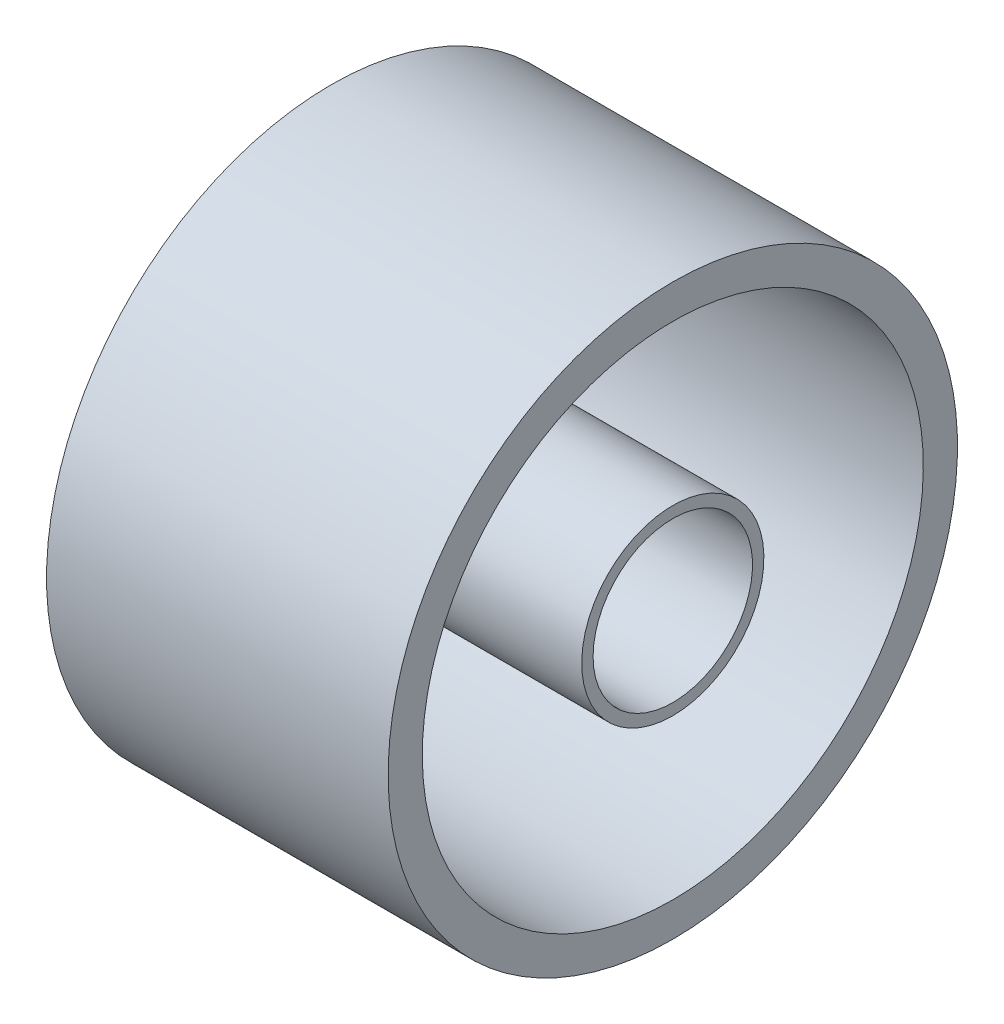
ISO-10303-21;
HEADER;
FILE_DESCRIPTION(('STEP AP214'),'2;1');
FILE_NAME('part.step','',(''),(''),'','','');
FILE_SCHEMA(('AUTOMOTIVE_DESIGN { 1 0 10303 214 1 1 1 1 }'));
ENDSEC;
DATA;
#1=APPLICATION_CONTEXT('core data for automotive mechanical design processes');
#2=APPLICATION_PROTOCOL_DEFINITION('international standard','automotive_design',2000,#1);
#3=PRODUCT_CONTEXT('',#1,'mechanical');
#4=PRODUCT('Part','Part','',(#3));
#5=PRODUCT_RELATED_PRODUCT_CATEGORY('part','',(#4));
#6=PRODUCT_DEFINITION_FORMATION('','',#4);
#7=PRODUCT_DEFINITION_CONTEXT('part definition',#1,'design');
#8=PRODUCT_DEFINITION('design','',#6,#7);
#9=PRODUCT_DEFINITION_SHAPE('','',#8);
#10=(LENGTH_UNIT() NAMED_UNIT(*) SI_UNIT(.MILLI.,.METRE.));
#11=(NAMED_UNIT(*) PLANE_ANGLE_UNIT() SI_UNIT($,.RADIAN.));
#12=(NAMED_UNIT(*) SI_UNIT($,.STERADIAN.) SOLID_ANGLE_UNIT());
#13=UNCERTAINTY_MEASURE_WITH_UNIT(LENGTH_MEASURE(1.E-05),#10,'distance_accuracy_value','');
#14=(GEOMETRIC_REPRESENTATION_CONTEXT(3) GLOBAL_UNCERTAINTY_ASSIGNED_CONTEXT((#13)) GLOBAL_UNIT_ASSIGNED_CONTEXT((#10,
#11,#12)) REPRESENTATION_CONTEXT('',''));
#15=CARTESIAN_POINT('',(0.,0.,0.));
#16=DIRECTION('',(0.,0.,1.));
#17=DIRECTION('',(1.,0.,0.));
#18=AXIS2_PLACEMENT_3D('',#15,#16,#17);
#19=CARTESIAN_POINT('',(30.,0.,0.));
#20=DIRECTION('',(-1.,0.,0.));
#21=DIRECTION('',(0.,-1.,0.));
#22=AXIS2_PLACEMENT_3D('',#19,#20,#21);
#23=CYLINDRICAL_SURFACE('',#22,22.);
#24=CARTESIAN_POINT('',(30.,0.,0.));
#25=DIRECTION('',(-1.,0.,0.));
#26=DIRECTION('',(0.,-1.,0.));
#27=AXIS2_PLACEMENT_3D('',#24,#25,#26);
#28=CIRCLE('',#27,22.);
#29=CARTESIAN_POINT('',(30.,-22.,0.));
#30=VERTEX_POINT('',#29);
#31=EDGE_CURVE('E171',#30,#30,#28,.T.);
#32=ORIENTED_EDGE('',*,*,#31,.F.);
#33=EDGE_LOOP('',(#32));
#34=FACE_BOUND('',#33,.T.);
#35=DIRECTION('',(-1.,0.,0.));
#36=VECTOR('',#35,1.);
#37=CARTESIAN_POINT('',(2.,0.,22.));
#38=LINE('',#37,#36);
#39=CARTESIAN_POINT('',(2.,0.,22.));
#40=VERTEX_POINT('',#39);
#41=CARTESIAN_POINT('',(0.,0.,22.));
#42=VERTEX_POINT('',#41);
#43=EDGE_CURVE('E52',#40,#42,#38,.T.);
#44=ORIENTED_EDGE('',*,*,#43,.F.);
#45=CARTESIAN_POINT('',(2.,0.,0.));
#46=DIRECTION('',(-1.,0.,0.));
#47=DIRECTION('',(0.,-1.,0.));
#48=AXIS2_PLACEMENT_3D('',#45,#46,#47);
#49=CIRCLE('',#48,22.);
#50=CARTESIAN_POINT('',(2.,2.,21.9089023002066));
#51=VERTEX_POINT('',#50);
#52=EDGE_CURVE('E56',#51,#40,#49,.F.);
#53=ORIENTED_EDGE('',*,*,#52,.F.);
#54=DIRECTION('',(-1.,0.,0.));
#55=VECTOR('',#54,1.);
#56=CARTESIAN_POINT('',(30.,2.00000000000001,21.9089023002066));
#57=LINE('',#56,#55);
#58=CARTESIAN_POINT('',(0.,2.,21.9089023002066));
#59=VERTEX_POINT('',#58);
#60=EDGE_CURVE('E111',#51,#59,#57,.T.);
#61=ORIENTED_EDGE('',*,*,#60,.T.);
#62=CARTESIAN_POINT('',(0.,0.,0.));
#63=DIRECTION('',(-1.,0.,0.));
#64=DIRECTION('',(0.,-1.,0.));
#65=AXIS2_PLACEMENT_3D('',#62,#63,#64);
#66=CIRCLE('',#65,22.);
#67=CARTESIAN_POINT('',(0.,2.,-21.9089023002066));
#68=VERTEX_POINT('',#67);
#69=EDGE_CURVE('E100',#59,#68,#66,.T.);
#70=ORIENTED_EDGE('',*,*,#69,.T.);
#71=DIRECTION('',(-1.,0.,0.));
#72=VECTOR('',#71,1.);
#73=CARTESIAN_POINT('',(30.,2.,-21.9089023002066));
#74=LINE('',#73,#72);
#75=CARTESIAN_POINT('',(2.,2.,-21.9089023002066));
#76=VERTEX_POINT('',#75);
#77=EDGE_CURVE('E179',#76,#68,#74,.T.);
#78=ORIENTED_EDGE('',*,*,#77,.F.);
#79=CARTESIAN_POINT('',(2.,0.,0.));
#80=DIRECTION('',(-1.,0.,0.));
#81=DIRECTION('',(0.,-1.,0.));
#82=AXIS2_PLACEMENT_3D('',#79,#80,#81);
#83=CIRCLE('',#82,22.);
#84=CARTESIAN_POINT('',(2.,0.,-22.));
#85=VERTEX_POINT('',#84);
#86=EDGE_CURVE('E174',#85,#76,#83,.F.);
#87=ORIENTED_EDGE('',*,*,#86,.F.);
#88=DIRECTION('',(-1.,0.,0.));
#89=VECTOR('',#88,1.);
#90=CARTESIAN_POINT('',(2.,0.,-22.));
#91=LINE('',#90,#89);
#92=CARTESIAN_POINT('',(0.,0.,-22.));
#93=VERTEX_POINT('',#92);
#94=EDGE_CURVE('E162',#85,#93,#91,.T.);
#95=ORIENTED_EDGE('',*,*,#94,.T.);
#96=EDGE_CURVE('E108',#93,#42,#66,.T.);
#97=ORIENTED_EDGE('',*,*,#96,.T.);
#98=EDGE_LOOP('',(#44,#53,#61,#70,#78,#87,#95,#97));
#99=FACE_BOUND('',#98,.T.);
#100=ADVANCED_FACE('F37',(#34,#99),#23,.F.);
#101=CARTESIAN_POINT('',(30.,0.,0.));
#102=DIRECTION('',(-1.,0.,0.));
#103=DIRECTION('',(0.,-1.,0.));
#104=AXIS2_PLACEMENT_3D('',#101,#102,#103);
#105=CYLINDRICAL_SURFACE('',#104,8.);
#106=CARTESIAN_POINT('',(30.,0.,0.));
#107=DIRECTION('',(-1.,0.,0.));
#108=DIRECTION('',(0.,-1.,0.));
#109=AXIS2_PLACEMENT_3D('',#106,#107,#108);
#110=CIRCLE('',#109,8.);
#111=CARTESIAN_POINT('',(30.,-7.99999999999999,0.));
#112=VERTEX_POINT('',#111);
#113=EDGE_CURVE('E137',#112,#112,#110,.T.);
#114=ORIENTED_EDGE('',*,*,#113,.T.);
#115=EDGE_LOOP('',(#114));
#116=FACE_BOUND('',#115,.T.);
#117=CARTESIAN_POINT('',(2.,0.,0.));
#118=DIRECTION('',(-1.,0.,0.));
#119=DIRECTION('',(0.,-1.,0.));
#120=AXIS2_PLACEMENT_3D('',#117,#118,#119);
#121=CIRCLE('',#120,8.);
#122=CARTESIAN_POINT('',(2.,2.,7.74596669241483));
#123=VERTEX_POINT('',#122);
#124=CARTESIAN_POINT('',(2.,0.,8.));
#125=VERTEX_POINT('',#124);
#126=EDGE_CURVE('E121',#123,#125,#121,.F.);
#127=ORIENTED_EDGE('',*,*,#126,.T.);
#128=DIRECTION('',(-1.,0.,0.));
#129=VECTOR('',#128,1.);
#130=CARTESIAN_POINT('',(30.,0.,8.));
#131=LINE('',#130,#129);
#132=CARTESIAN_POINT('',(0.,0.,8.));
#133=VERTEX_POINT('',#132);
#134=EDGE_CURVE('E116',#125,#133,#131,.T.);
#135=ORIENTED_EDGE('',*,*,#134,.T.);
#136=CARTESIAN_POINT('',(0.,0.,0.));
#137=DIRECTION('',(-1.,0.,0.));
#138=DIRECTION('',(0.,-1.,0.));
#139=AXIS2_PLACEMENT_3D('',#136,#137,#138);
#140=CIRCLE('',#139,8.);
#141=CARTESIAN_POINT('',(0.,0.,-8.));
#142=VERTEX_POINT('',#141);
#143=EDGE_CURVE('E141',#142,#133,#140,.T.);
#144=ORIENTED_EDGE('',*,*,#143,.F.);
#145=DIRECTION('',(-1.,0.,0.));
#146=VECTOR('',#145,1.);
#147=CARTESIAN_POINT('',(30.,0.,-8.));
#148=LINE('',#147,#146);
#149=CARTESIAN_POINT('',(2.,0.,-8.));
#150=VERTEX_POINT('',#149);
#151=EDGE_CURVE('E45',#142,#150,#148,.F.);
#152=ORIENTED_EDGE('',*,*,#151,.T.);
#153=CARTESIAN_POINT('',(2.,0.,0.));
#154=DIRECTION('',(-1.,0.,0.));
#155=DIRECTION('',(0.,-1.,0.));
#156=AXIS2_PLACEMENT_3D('',#153,#154,#155);
#157=CIRCLE('',#156,8.);
#158=CARTESIAN_POINT('',(2.,2.,-7.74596669241483));
#159=VERTEX_POINT('',#158);
#160=EDGE_CURVE('E147',#159,#150,#157,.T.);
#161=ORIENTED_EDGE('',*,*,#160,.F.);
#162=DIRECTION('',(-1.,0.,0.));
#163=VECTOR('',#162,1.);
#164=CARTESIAN_POINT('',(30.,2.,-7.74596669241483));
#165=LINE('',#164,#163);
#166=CARTESIAN_POINT('',(0.,2.,-7.74596669241483));
#167=VERTEX_POINT('',#166);
#168=EDGE_CURVE('E152',#167,#159,#165,.F.);
#169=ORIENTED_EDGE('',*,*,#168,.F.);
#170=CARTESIAN_POINT('',(0.,2.,7.74596669241483));
#171=VERTEX_POINT('',#170);
#172=EDGE_CURVE('E115',#171,#167,#140,.T.);
#173=ORIENTED_EDGE('',*,*,#172,.F.);
#174=DIRECTION('',(-1.,0.,0.));
#175=VECTOR('',#174,1.);
#176=CARTESIAN_POINT('',(30.,2.,7.74596669241483));
#177=LINE('',#176,#175);
#178=EDGE_CURVE('E11',#123,#171,#177,.T.);
#179=ORIENTED_EDGE('',*,*,#178,.F.);
#180=EDGE_LOOP('',(#127,#135,#144,#152,#161,#169,#173,#179));
#181=FACE_BOUND('',#180,.T.);
#182=ADVANCED_FACE('F182',(#116,#181),#105,.T.);
#183=CARTESIAN_POINT('',(0.,0.,0.));
#184=DIRECTION('',(1.,0.,0.));
#185=DIRECTION('',(0.,1.,0.));
#186=AXIS2_PLACEMENT_3D('',#183,#184,#185);
#187=PLANE('',#186);
#188=DIRECTION('',(0.,0.,-1.));
#189=VECTOR('',#188,1.);
#190=CARTESIAN_POINT('',(0.,0.,22.));
#191=LINE('',#190,#189);
#192=EDGE_CURVE('E122',#42,#133,#191,.T.);
#193=ORIENTED_EDGE('',*,*,#192,.F.);
#194=ORIENTED_EDGE('',*,*,#96,.F.);
#195=DIRECTION('',(0.,0.,1.));
#196=VECTOR('',#195,1.);
#197=CARTESIAN_POINT('',(0.,0.,-22.));
#198=LINE('',#197,#196);
#199=EDGE_CURVE('E155',#93,#142,#198,.T.);
#200=ORIENTED_EDGE('',*,*,#199,.T.);
#201=ORIENTED_EDGE('',*,*,#143,.T.);
#202=EDGE_LOOP('',(#193,#194,#200,#201));
#203=FACE_BOUND('',#202,.T.);
#204=ORIENTED_EDGE('',*,*,#69,.F.);
#205=DIRECTION('',(0.,0.,-1.));
#206=VECTOR('',#205,1.);
#207=CARTESIAN_POINT('',(0.,2.,22.));
#208=LINE('',#207,#206);
#209=EDGE_CURVE('E104',#59,#171,#208,.T.);
#210=ORIENTED_EDGE('',*,*,#209,.T.);
#211=ORIENTED_EDGE('',*,*,#172,.T.);
#212=DIRECTION('',(0.,0.,1.));
#213=VECTOR('',#212,1.);
#214=CARTESIAN_POINT('',(0.,2.,-22.));
#215=LINE('',#214,#213);
#216=EDGE_CURVE('E106',#68,#167,#215,.T.);
#217=ORIENTED_EDGE('',*,*,#216,.F.);
#218=EDGE_LOOP('',(#204,#210,#211,#217));
#219=FACE_BOUND('',#218,.T.);
#220=CARTESIAN_POINT('',(0.,0.,0.));
#221=DIRECTION('',(-1.,0.,0.));
#222=DIRECTION('',(0.,0.,1.));
#223=AXIS2_PLACEMENT_3D('',#220,#221,#222);
#224=CIRCLE('',#223,7.);
#225=CARTESIAN_POINT('',(0.,0.,7.));
#226=VERTEX_POINT('',#225);
#227=EDGE_CURVE('E140',#226,#226,#224,.T.);
#228=ORIENTED_EDGE('',*,*,#227,.F.);
#229=EDGE_LOOP('',(#228));
#230=FACE_BOUND('',#229,.T.);
#231=CARTESIAN_POINT('',(0.,0.,0.));
#232=DIRECTION('',(1.,0.,0.));
#233=DIRECTION('',(0.,1.,0.));
#234=AXIS2_PLACEMENT_3D('',#231,#232,#233);
#235=CIRCLE('',#234,25.);
#236=CARTESIAN_POINT('',(0.,25.,0.));
#237=VERTEX_POINT('',#236);
#238=EDGE_CURVE('E168',#237,#237,#235,.T.);
#239=ORIENTED_EDGE('',*,*,#238,.F.);
#240=EDGE_LOOP('',(#239));
#241=FACE_BOUND('',#240,.T.);
#242=ADVANCED_FACE('F101',(#203,#219,#230,#241),#187,.F.);
#243=CARTESIAN_POINT('',(30.,0.,0.));
#244=DIRECTION('',(1.,0.,0.));
#245=DIRECTION('',(0.,1.,0.));
#246=AXIS2_PLACEMENT_3D('',#243,#244,#245);
#247=CYLINDRICAL_SURFACE('',#246,25.);
#248=CARTESIAN_POINT('',(30.,0.,0.));
#249=DIRECTION('',(1.,0.,0.));
#250=DIRECTION('',(0.,1.,0.));
#251=AXIS2_PLACEMENT_3D('',#248,#249,#250);
#252=CIRCLE('',#251,25.);
#253=CARTESIAN_POINT('',(30.,25.,0.));
#254=VERTEX_POINT('',#253);
#255=EDGE_CURVE('E109',#254,#254,#252,.T.);
#256=ORIENTED_EDGE('',*,*,#255,.F.);
#257=EDGE_LOOP('',(#256));
#258=FACE_BOUND('',#257,.T.);
#259=ORIENTED_EDGE('',*,*,#238,.T.);
#260=EDGE_LOOP('',(#259));
#261=FACE_BOUND('',#260,.T.);
#262=ADVANCED_FACE('F202',(#258,#261),#247,.T.);
#263=CARTESIAN_POINT('',(30.,-25.,0.));
#264=DIRECTION('',(-1.,0.,0.));
#265=DIRECTION('',(0.,-1.,0.));
#266=AXIS2_PLACEMENT_3D('',#263,#264,#265);
#267=PLANE('',#266);
#268=ORIENTED_EDGE('',*,*,#31,.T.);
#269=EDGE_LOOP('',(#268));
#270=FACE_BOUND('',#269,.T.);
#271=ORIENTED_EDGE('',*,*,#255,.T.);
#272=EDGE_LOOP('',(#271));
#273=FACE_BOUND('',#272,.T.);
#274=ADVANCED_FACE('F39',(#270,#273),#267,.F.);
#275=CARTESIAN_POINT('',(2.,2.,-22.));
#276=DIRECTION('',(0.,-1.,0.));
#277=DIRECTION('',(1.,0.,0.));
#278=AXIS2_PLACEMENT_3D('',#275,#276,#277);
#279=PLANE('',#278);
#280=ORIENTED_EDGE('',*,*,#216,.T.);
#281=ORIENTED_EDGE('',*,*,#168,.T.);
#282=DIRECTION('',(0.,0.,1.));
#283=VECTOR('',#282,1.);
#284=CARTESIAN_POINT('',(2.,2.,-22.));
#285=LINE('',#284,#283);
#286=EDGE_CURVE('E159',#76,#159,#285,.T.);
#287=ORIENTED_EDGE('',*,*,#286,.F.);
#288=ORIENTED_EDGE('',*,*,#77,.T.);
#289=EDGE_LOOP('',(#280,#281,#287,#288));
#290=FACE_BOUND('',#289,.T.);
#291=ADVANCED_FACE('F193',(#290),#279,.F.);
#292=CARTESIAN_POINT('',(2.,0.,0.));
#293=DIRECTION('',(-1.,0.,0.));
#294=DIRECTION('',(0.,-1.,0.));
#295=AXIS2_PLACEMENT_3D('',#292,#293,#294);
#296=PLANE('',#295);
#297=ORIENTED_EDGE('',*,*,#286,.T.);
#298=ORIENTED_EDGE('',*,*,#160,.T.);
#299=DIRECTION('',(0.,0.,1.));
#300=VECTOR('',#299,1.);
#301=CARTESIAN_POINT('',(2.,0.,-22.));
#302=LINE('',#301,#300);
#303=EDGE_CURVE('E156',#85,#150,#302,.T.);
#304=ORIENTED_EDGE('',*,*,#303,.F.);
#305=ORIENTED_EDGE('',*,*,#86,.T.);
#306=EDGE_LOOP('',(#297,#298,#304,#305));
#307=FACE_BOUND('',#306,.T.);
#308=ADVANCED_FACE('F188',(#307),#296,.F.);
#309=CARTESIAN_POINT('',(2.,0.,-22.));
#310=DIRECTION('',(0.,-1.,0.));
#311=DIRECTION('',(1.,0.,0.));
#312=AXIS2_PLACEMENT_3D('',#309,#310,#311);
#313=PLANE('',#312);
#314=ORIENTED_EDGE('',*,*,#151,.F.);
#315=ORIENTED_EDGE('',*,*,#199,.F.);
#316=ORIENTED_EDGE('',*,*,#94,.F.);
#317=ORIENTED_EDGE('',*,*,#303,.T.);
#318=EDGE_LOOP('',(#314,#315,#316,#317));
#319=FACE_BOUND('',#318,.T.);
#320=ADVANCED_FACE('F191',(#319),#313,.T.);
#321=CARTESIAN_POINT('',(30.,0.,0.));
#322=DIRECTION('',(-1.,0.,0.));
#323=DIRECTION('',(0.,0.,1.));
#324=AXIS2_PLACEMENT_3D('',#321,#322,#323);
#325=CYLINDRICAL_SURFACE('',#324,7.);
#326=CARTESIAN_POINT('',(30.,0.,0.));
#327=DIRECTION('',(-1.,0.,0.));
#328=DIRECTION('',(0.,0.,1.));
#329=AXIS2_PLACEMENT_3D('',#326,#327,#328);
#330=CIRCLE('',#329,7.);
#331=CARTESIAN_POINT('',(30.,0.,7.));
#332=VERTEX_POINT('',#331);
#333=EDGE_CURVE('E144',#332,#332,#330,.T.);
#334=CARTESIAN_POINT('',(0.,0.,7.));
#335=CARTESIAN_POINT('',(0.312500000000001,0.,7.));
#336=CARTESIAN_POINT('',(0.625000000000001,0.,7.));
#337=CARTESIAN_POINT('',(1.25,0.,7.));
#338=CARTESIAN_POINT('',(1.5625,0.,7.));
#339=CARTESIAN_POINT('',(2.1875,0.,7.));
#340=CARTESIAN_POINT('',(2.5,0.,7.));
#341=CARTESIAN_POINT('',(3.125,0.,7.));
#342=CARTESIAN_POINT('',(3.4375,0.,7.));
#343=CARTESIAN_POINT('',(4.0625,0.,7.));
#344=CARTESIAN_POINT('',(4.375,0.,7.));
#345=CARTESIAN_POINT('',(5.,0.,7.));
#346=CARTESIAN_POINT('',(5.3125,0.,7.));
#347=CARTESIAN_POINT('',(5.9375,0.,7.));
#348=CARTESIAN_POINT('',(6.25,0.,7.));
#349=CARTESIAN_POINT('',(6.875,0.,7.));
#350=CARTESIAN_POINT('',(7.1875,0.,7.));
#351=CARTESIAN_POINT('',(7.8125,0.,7.));
#352=CARTESIAN_POINT('',(8.125,0.,7.));
#353=CARTESIAN_POINT('',(8.75,0.,7.));
#354=CARTESIAN_POINT('',(9.0625,0.,7.));
#355=CARTESIAN_POINT('',(9.6875,0.,7.));
#356=CARTESIAN_POINT('',(10.,0.,7.));
#357=CARTESIAN_POINT('',(10.625,0.,7.));
#358=CARTESIAN_POINT('',(10.9375,0.,7.));
#359=CARTESIAN_POINT('',(11.5625,0.,7.));
#360=CARTESIAN_POINT('',(11.875,0.,7.));
#361=CARTESIAN_POINT('',(12.5,0.,7.));
#362=CARTESIAN_POINT('',(12.8125,0.,7.));
#363=CARTESIAN_POINT('',(13.4375,0.,7.));
#364=CARTESIAN_POINT('',(13.75,0.,7.));
#365=CARTESIAN_POINT('',(14.375,0.,7.));
#366=CARTESIAN_POINT('',(14.6875,0.,7.));
#367=CARTESIAN_POINT('',(15.3125,0.,7.));
#368=CARTESIAN_POINT('',(15.625,0.,7.));
#369=CARTESIAN_POINT('',(16.25,0.,7.));
#370=CARTESIAN_POINT('',(16.5625,0.,7.));
#371=CARTESIAN_POINT('',(17.1875,0.,7.));
#372=CARTESIAN_POINT('',(17.5,0.,7.));
#373=CARTESIAN_POINT('',(18.125,0.,7.));
#374=CARTESIAN_POINT('',(18.4375,0.,7.));
#375=CARTESIAN_POINT('',(19.0625,0.,7.));
#376=CARTESIAN_POINT('',(19.375,0.,7.));
#377=CARTESIAN_POINT('',(20.,0.,7.));
#378=CARTESIAN_POINT('',(20.3125,0.,7.));
#379=CARTESIAN_POINT('',(20.9375,0.,7.));
#380=CARTESIAN_POINT('',(21.25,0.,7.));
#381=CARTESIAN_POINT('',(21.875,0.,7.));
#382=CARTESIAN_POINT('',(22.1875,0.,7.));
#383=CARTESIAN_POINT('',(22.8125,0.,7.));
#384=CARTESIAN_POINT('',(23.125,0.,7.));
#385=CARTESIAN_POINT('',(23.75,0.,7.));
#386=CARTESIAN_POINT('',(24.0625,0.,7.));
#387=CARTESIAN_POINT('',(24.6875,0.,7.));
#388=CARTESIAN_POINT('',(25.,0.,7.));
#389=CARTESIAN_POINT('',(25.625,0.,7.));
#390=CARTESIAN_POINT('',(25.9375,0.,7.));
#391=CARTESIAN_POINT('',(26.5625,0.,7.));
#392=CARTESIAN_POINT('',(26.875,0.,7.));
#393=CARTESIAN_POINT('',(27.5,0.,7.));
#394=CARTESIAN_POINT('',(27.8125,0.,7.));
#395=CARTESIAN_POINT('',(28.4375,0.,7.));
#396=CARTESIAN_POINT('',(28.75,0.,7.));
#397=CARTESIAN_POINT('',(29.375,0.,7.));
#398=CARTESIAN_POINT('',(29.6875,0.,7.));
#399=CARTESIAN_POINT('',(30.,0.,7.));
#400=B_SPLINE_CURVE_WITH_KNOTS('',3,(#334,#335,#336,#337,#338,#339,#340,#341,#342,#343,#344,
#345,#346,#347,#348,#349,#350,#351,#352,#353,#354,#355,#356,#357,#358,#359,#360,#361,#362,#363,
#364,#365,#366,#367,#368,#369,#370,#371,#372,#373,#374,#375,#376,#377,#378,#379,#380,#381,#382,
#383,#384,#385,#386,#387,#388,#389,#390,#391,#392,#393,#394,#395,#396,#397,#398,#399),
.UNSPECIFIED.,.F.,.F.,(4,2,2,2,2,2,2,2,2,2,2,2,2,2,2,2,2,2,2,2,2,2,2,2,2,2,2,2,2,2,2,2,4),(0.,
0.937500000000001,1.875,2.8125,3.75,4.6875,5.625,6.5625,7.5,8.4375,9.375,10.3125,11.25,12.1875,
13.125,14.0625,15.,15.9375,16.875,17.8125,18.75,19.6875,20.625,21.5625,22.5,23.4375,24.375,
25.3125,26.25,27.1875,28.125,29.0625,30.),.UNSPECIFIED.);
#401=EDGE_CURVE('BSEAM220',#226,#332,#400,.T.);
#402=ORIENTED_EDGE('',*,*,#227,.T.);
#403=ORIENTED_EDGE('',*,*,#333,.F.);
#404=ORIENTED_EDGE('',*,*,#401,.T.);
#405=ORIENTED_EDGE('',*,*,#401,.F.);
#406=EDGE_LOOP('',(#402,#404,#403,#405));
#407=FACE_BOUND('',#406,.T.);
#408=ADVANCED_FACE('F220',(#407),#325,.F.);
#409=CARTESIAN_POINT('',(30.,-25.,0.));
#410=DIRECTION('',(-1.,0.,0.));
#411=DIRECTION('',(0.,-1.,0.));
#412=AXIS2_PLACEMENT_3D('',#409,#410,#411);
#413=PLANE('',#412);
#414=ORIENTED_EDGE('',*,*,#333,.T.);
#415=EDGE_LOOP('',(#414));
#416=FACE_BOUND('',#415,.T.);
#417=ORIENTED_EDGE('',*,*,#113,.F.);
#418=EDGE_LOOP('',(#417));
#419=FACE_BOUND('',#418,.T.);
#420=ADVANCED_FACE('F225',(#416,#419),#413,.F.);
#421=CARTESIAN_POINT('',(2.,2.,22.));
#422=DIRECTION('',(0.,1.,0.));
#423=DIRECTION('',(0.,0.,1.));
#424=AXIS2_PLACEMENT_3D('',#421,#422,#423);
#425=PLANE('',#424);
#426=ORIENTED_EDGE('',*,*,#60,.F.);
#427=DIRECTION('',(0.,0.,-1.));
#428=VECTOR('',#427,1.);
#429=CARTESIAN_POINT('',(2.,2.,22.));
#430=LINE('',#429,#428);
#431=EDGE_CURVE('E126',#51,#123,#430,.T.);
#432=ORIENTED_EDGE('',*,*,#431,.T.);
#433=ORIENTED_EDGE('',*,*,#178,.T.);
#434=ORIENTED_EDGE('',*,*,#209,.F.);
#435=EDGE_LOOP('',(#426,#432,#433,#434));
#436=FACE_BOUND('',#435,.T.);
#437=ADVANCED_FACE('F118',(#436),#425,.T.);
#438=CARTESIAN_POINT('',(2.,0.,0.));
#439=DIRECTION('',(-1.,0.,0.));
#440=DIRECTION('',(0.,-1.,0.));
#441=AXIS2_PLACEMENT_3D('',#438,#439,#440);
#442=PLANE('',#441);
#443=ORIENTED_EDGE('',*,*,#431,.F.);
#444=ORIENTED_EDGE('',*,*,#52,.T.);
#445=DIRECTION('',(0.,0.,-1.));
#446=VECTOR('',#445,1.);
#447=CARTESIAN_POINT('',(2.,0.,22.));
#448=LINE('',#447,#446);
#449=EDGE_CURVE('E130',#40,#125,#448,.T.);
#450=ORIENTED_EDGE('',*,*,#449,.T.);
#451=ORIENTED_EDGE('',*,*,#126,.F.);
#452=EDGE_LOOP('',(#443,#444,#450,#451));
#453=FACE_BOUND('',#452,.T.);
#454=ADVANCED_FACE('F195',(#453),#442,.F.);
#455=CARTESIAN_POINT('',(2.,0.,22.));
#456=DIRECTION('',(0.,1.,0.));
#457=DIRECTION('',(-1.,0.,0.));
#458=AXIS2_PLACEMENT_3D('',#455,#456,#457);
#459=PLANE('',#458);
#460=ORIENTED_EDGE('',*,*,#134,.F.);
#461=ORIENTED_EDGE('',*,*,#449,.F.);
#462=ORIENTED_EDGE('',*,*,#43,.T.);
#463=ORIENTED_EDGE('',*,*,#192,.T.);
#464=EDGE_LOOP('',(#460,#461,#462,#463));
#465=FACE_BOUND('',#464,.T.);
#466=ADVANCED_FACE('F198',(#465),#459,.F.);
#467=CLOSED_SHELL('',(#100,#182,#242,#262,#274,#291,#308,#320,#408,#420,#437,#454,#466));
#468=MANIFOLD_SOLID_BREP('B2',#467);
#469=ADVANCED_BREP_SHAPE_REPRESENTATION('',(#18,#468),#14);
#470=SHAPE_DEFINITION_REPRESENTATION(#9,#469);
ENDSEC;
END-ISO-10303-21;
